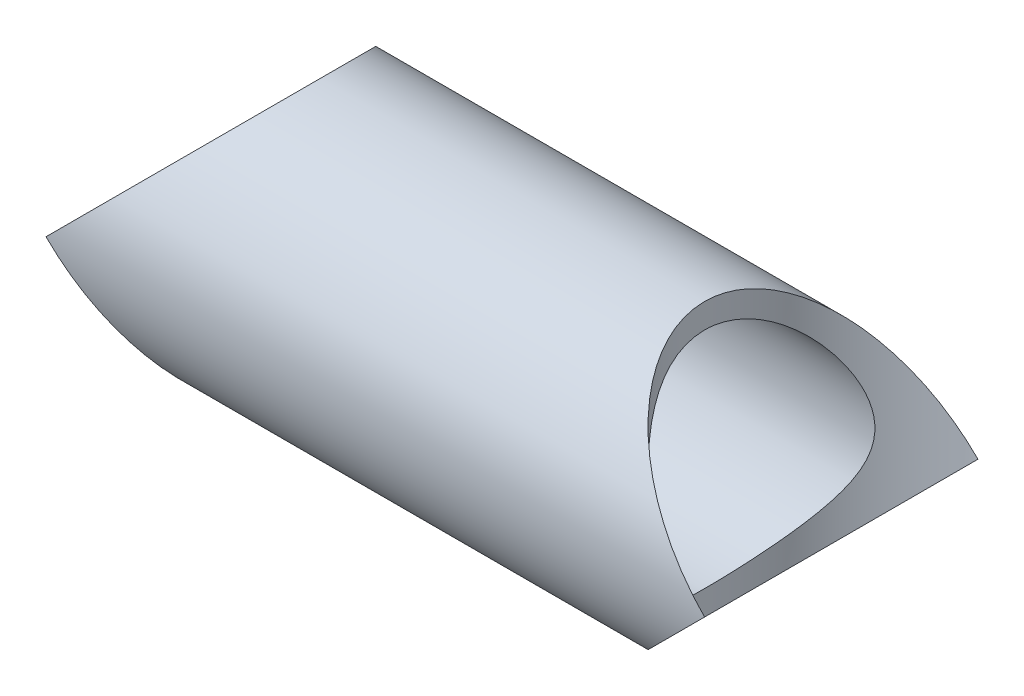
ISO-10303-21;
HEADER;
FILE_DESCRIPTION(('STEP AP214'),'2;1');
FILE_NAME('part.step','',(''),(''),'','','');
FILE_SCHEMA(('AUTOMOTIVE_DESIGN { 1 0 10303 214 1 1 1 1 }'));
ENDSEC;
DATA;
#1=APPLICATION_CONTEXT('core data for automotive mechanical design processes');
#2=APPLICATION_PROTOCOL_DEFINITION('international standard','automotive_design',2000,#1);
#3=PRODUCT_CONTEXT('',#1,'mechanical');
#4=PRODUCT('Part','Part','',(#3));
#5=PRODUCT_RELATED_PRODUCT_CATEGORY('part','',(#4));
#6=PRODUCT_DEFINITION_FORMATION('','',#4);
#7=PRODUCT_DEFINITION_CONTEXT('part definition',#1,'design');
#8=PRODUCT_DEFINITION('design','',#6,#7);
#9=PRODUCT_DEFINITION_SHAPE('','',#8);
#10=(LENGTH_UNIT() NAMED_UNIT(*) SI_UNIT(.MILLI.,.METRE.));
#11=(NAMED_UNIT(*) PLANE_ANGLE_UNIT() SI_UNIT($,.RADIAN.));
#12=(NAMED_UNIT(*) SI_UNIT($,.STERADIAN.) SOLID_ANGLE_UNIT());
#13=UNCERTAINTY_MEASURE_WITH_UNIT(LENGTH_MEASURE(1.E-05),#10,'distance_accuracy_value','');
#14=(GEOMETRIC_REPRESENTATION_CONTEXT(3) GLOBAL_UNCERTAINTY_ASSIGNED_CONTEXT((#13)) GLOBAL_UNIT_ASSIGNED_CONTEXT((#10,
#11,#12)) REPRESENTATION_CONTEXT('',''));
#15=CARTESIAN_POINT('',(0.,0.,0.));
#16=DIRECTION('',(0.,0.,1.));
#17=DIRECTION('',(1.,0.,0.));
#18=AXIS2_PLACEMENT_3D('',#15,#16,#17);
#19=CARTESIAN_POINT('',(0.,0.,0.));
#20=DIRECTION('',(1.,0.,0.));
#21=DIRECTION('',(0.,0.,-1.));
#22=AXIS2_PLACEMENT_3D('',#19,#20,#21);
#23=CYLINDRICAL_SURFACE('',#22,17.272);
#24=CARTESIAN_POINT('',(-21.082,17.272,0.));
#25=CARTESIAN_POINT('',(-21.0819974571892,17.271997400769,0.411969546046924));
#26=CARTESIAN_POINT('',(-21.0698979581089,17.2572347382735,0.82398266570214));
#27=CARTESIAN_POINT('',(-21.0217712674214,17.1984419810361,1.64467646555702));
#28=CARTESIAN_POINT('',(-20.9857322284046,17.1543973949897,2.05335539428116));
#29=CARTESIAN_POINT('',(-20.8904711960164,17.0377282079174,2.86462013572414));
#30=CARTESIAN_POINT('',(-20.8312073055811,16.9650519548038,3.26719356329438));
#31=CARTESIAN_POINT('',(-20.6908226929877,16.7923770824112,4.06246678309607));
#32=CARTESIAN_POINT('',(-20.6097042051748,16.6923812561846,4.45516758018942));
#33=CARTESIAN_POINT('',(-20.4278769814588,16.4673550193317,5.22573282350051));
#34=CARTESIAN_POINT('',(-20.3272985338859,16.3424909517279,5.6036768900091));
#35=CARTESIAN_POINT('',(-20.1081013138992,16.0690286184839,6.34543751861682));
#36=CARTESIAN_POINT('',(-19.9894824728678,15.9204302625689,6.70925402697433));
#37=CARTESIAN_POINT('',(-19.7362399951363,15.6012775827915,7.42120493645665));
#38=CARTESIAN_POINT('',(-19.6016199309319,15.4307281591085,7.76934281420934));
#39=CARTESIAN_POINT('',(-19.3183957146022,15.0693154120948,8.4490195623764));
#40=CARTESIAN_POINT('',(-19.1697886381679,14.8784478396864,8.78055493935614));
#41=CARTESIAN_POINT('',(-18.8050246129541,14.4059100339488,9.54246297905149));
#42=CARTESIAN_POINT('',(-18.583796883026,14.1162727394238,9.96549372592007));
#43=CARTESIAN_POINT('',(-18.1243638254064,13.5057131163688,10.778513444702));
#44=CARTESIAN_POINT('',(-17.8861528723319,13.1847804087374,11.1684913739729));
#45=CARTESIAN_POINT('',(-17.397190804996,12.5134565283622,11.9158876755438));
#46=CARTESIAN_POINT('',(-17.1464084909186,12.1629904272153,12.2732181268326));
#47=CARTESIAN_POINT('',(-16.6380816184922,11.4352470478156,12.9539720469538));
#48=CARTESIAN_POINT('',(-16.3805378870474,11.0579730385598,13.2773996380877));
#49=CARTESIAN_POINT('',(-15.8597451820756,10.2709022503498,13.8955112849849));
#50=CARTESIAN_POINT('',(-15.5964739788716,9.86065951423709,14.1896089758705));
#51=CARTESIAN_POINT('',(-15.0751602485807,9.01350765030095,14.7422722270848));
#52=CARTESIAN_POINT('',(-14.8171194827016,8.5765897326821,15.0008259830028));
#53=CARTESIAN_POINT('',(-14.3149717526541,7.67652626118942,15.4807119999985));
#54=CARTESIAN_POINT('',(-14.070833876304,7.21344385084406,15.7021291515829));
#55=CARTESIAN_POINT('',(-13.7226228026443,6.49805660466487,16.0051278072619));
#56=CARTESIAN_POINT('',(-13.609585318976,6.2562149887016,16.1012465180021));
#57=CARTESIAN_POINT('',(-13.3910671702633,5.76544358591262,16.2834359902852));
#58=CARTESIAN_POINT('',(-13.2855879175507,5.51651248642654,16.3695048757984));
#59=CARTESIAN_POINT('',(-12.9524393884434,4.68200907547958,16.6365084203585));
#60=CARTESIAN_POINT('',(-12.7446096245939,4.08036836698642,16.7949505173963));
#61=CARTESIAN_POINT('',(-12.4895307485763,3.15396408208561,16.984512209331));
#62=CARTESIAN_POINT('',(-12.4140142927317,2.84162103788167,17.0396393227736));
#63=CARTESIAN_POINT('',(-12.2848487749683,2.21000018322315,17.1329967954062));
#64=CARTESIAN_POINT('',(-12.2311868728216,1.89072656118795,17.17123707725));
#65=CARTESIAN_POINT('',(-12.156393183993,1.30972387108432,17.224241369686));
#66=CARTESIAN_POINT('',(-12.130974529567,1.04882275454375,17.2421173525233));
#67=CARTESIAN_POINT('',(-12.0969594703745,0.525288392474299,17.2659992303282));
#68=CARTESIAN_POINT('',(-12.0883682437612,0.262654638714181,17.2720014715016));
#69=CARTESIAN_POINT('',(-12.0883767032652,-0.313709266542585,17.2719982424689));
#70=CARTESIAN_POINT('',(-12.1006425521989,-0.627448326348049,17.263431937013));
#71=CARTESIAN_POINT('',(-12.1490638187679,-1.25225888022392,17.2293881403538));
#72=CARTESIAN_POINT('',(-12.1852310167793,-1.56332898220732,17.2039023099121));
#73=CARTESIAN_POINT('',(-12.2797345720248,-2.18094423110293,17.1365746034446));
#74=CARTESIAN_POINT('',(-12.3381191885186,-2.48747800792352,17.0946971168044));
#75=CARTESIAN_POINT('',(-12.4744560593086,-3.09364467723231,16.9954628363119));
#76=CARTESIAN_POINT('',(-12.552415488627,-3.39327499523887,16.9381003659578));
#77=CARTESIAN_POINT('',(-12.756963505347,-4.09409497947193,16.78488590863));
#78=CARTESIAN_POINT('',(-12.8908657317345,-4.49175633476133,16.6826485760223));
#79=CARTESIAN_POINT('',(-13.1825232390176,-5.27075628352036,16.4531520564412));
#80=CARTESIAN_POINT('',(-13.3402898260654,-5.65208702961766,16.3258810006799));
#81=CARTESIAN_POINT('',(-13.6735973789277,-6.39926736461119,16.0477625128062));
#82=CARTESIAN_POINT('',(-13.8491844052273,-6.76507318203271,15.896853407417));
#83=CARTESIAN_POINT('',(-14.2123694461541,-7.48048207309385,15.573006641214));
#84=CARTESIAN_POINT('',(-14.3999670650766,-7.83008567988304,15.4000697059503));
#85=CARTESIAN_POINT('',(-14.8607453832388,-8.65287033366831,14.9582100637985));
#86=CARTESIAN_POINT('',(-15.1376666432576,-9.1183965914384,14.6788789201623));
#87=CARTESIAN_POINT('',(-15.6967792901481,-10.0192128678948,14.0794214498589));
#88=CARTESIAN_POINT('',(-15.9789727300897,-10.4544907823033,13.7592789355778));
#89=CARTESIAN_POINT('',(-16.5403675992567,-11.2939007838856,13.0790406954938));
#90=CARTESIAN_POINT('',(-16.8195715322211,-11.6980610333705,12.7189818327195));
#91=CARTESIAN_POINT('',(-17.3682011107248,-12.4740062829321,11.9589252456115));
#92=CARTESIAN_POINT('',(-17.6376302361273,-12.8458028718657,11.5589419285744));
#93=CARTESIAN_POINT('',(-18.1063729386441,-13.481393910569,10.8057503562355));
#94=CARTESIAN_POINT('',(-18.3087012447039,-13.7516641240993,10.4598673674054));
#95=CARTESIAN_POINT('',(-18.6998339721646,-14.2682701887558,9.7433803197121));
#96=CARTESIAN_POINT('',(-18.8886389572698,-14.51460703767,9.37277729252075));
#97=CARTESIAN_POINT('',(-19.2491642892864,-14.9807667784142,8.608069734366));
#98=CARTESIAN_POINT('',(-19.420906268794,-15.2006233192589,8.21399600092984));
#99=CARTESIAN_POINT('',(-19.7442089787664,-15.6115705713909,7.403194645415));
#100=CARTESIAN_POINT('',(-19.8957732353394,-15.8026663094652,6.98647099943797));
#101=CARTESIAN_POINT('',(-20.1518934390218,-16.1238269123025,6.20416858228577));
#102=CARTESIAN_POINT('',(-20.2600687905135,-16.2587512811017,5.84176455996164));
#103=CARTESIAN_POINT('',(-20.4583196746215,-16.5051343125671,5.10427293441255));
#104=CARTESIAN_POINT('',(-20.5483985457555,-16.6165973036723,4.7291876856201));
#105=CARTESIAN_POINT('',(-20.7087698302159,-16.8145107009343,3.96845301096871));
#106=CARTESIAN_POINT('',(-20.7790691326883,-16.9009698161357,3.58280731475349));
#107=CARTESIAN_POINT('',(-20.8985100685957,-17.047603763313,2.803293837013));
#108=CARTESIAN_POINT('',(-20.9476514546421,-17.107778287957,2.40942595940647));
#109=CARTESIAN_POINT('',(-21.0238707932101,-17.2010211639035,1.61477812574959));
#110=CARTESIAN_POINT('',(-21.0508613298558,-17.23398212293,1.21397709739105));
#111=CARTESIAN_POINT('',(-21.0818466847301,-17.2718162976593,0.410156935764197));
#112=CARTESIAN_POINT('',(-21.0858414563436,-17.2766894564248,0.007137798001182));
#113=CARTESIAN_POINT('',(-21.070744373257,-17.2582605045352,-0.797812951281574));
#114=CARTESIAN_POINT('',(-21.0516527199516,-17.2349586396653,-1.19974457225762));
#115=CARTESIAN_POINT('',(-20.9908155184505,-17.1605959506735,-1.9992803453275));
#116=CARTESIAN_POINT('',(-20.9490706344321,-17.1095359404015,-2.39688462394745));
#117=CARTESIAN_POINT('',(-20.8471039715095,-16.9845289087982,-3.16038819356661));
#118=CARTESIAN_POINT('',(-20.788183768376,-16.9121916486331,-3.52672810743099));
#119=CARTESIAN_POINT('',(-20.6523002604325,-16.7448842276505,-4.25075088374505));
#120=CARTESIAN_POINT('',(-20.5753378628998,-16.6499152048993,-4.60843418050755));
#121=CARTESIAN_POINT('',(-20.4046709947555,-16.4385445049941,-5.31334842362213));
#122=CARTESIAN_POINT('',(-20.3109640610799,-16.3221396746293,-5.66057782344964));
#123=CARTESIAN_POINT('',(-20.1082888931914,-16.0692333956989,-6.3430419065265));
#124=CARTESIAN_POINT('',(-19.9993197568016,-15.9327307590907,-6.67827587923236));
#125=CARTESIAN_POINT('',(-19.7572004272866,-15.6277825875954,-7.36533449589875));
#126=CARTESIAN_POINT('',(-19.6227543044437,-15.4575641647838,-7.71591466311745));
#127=CARTESIAN_POINT('',(-19.3396613475592,-15.0965660542174,-8.40032132931948));
#128=CARTESIAN_POINT('',(-19.1910138123467,-14.9057853511748,-8.73414699983507));
#129=CARTESIAN_POINT('',(-18.8815704327287,-14.5052110810432,-9.38438563691978));
#130=CARTESIAN_POINT('',(-18.7207718189411,-14.2954131775104,-9.70079460543201));
#131=CARTESIAN_POINT('',(-18.3891035721379,-13.8582347484962,-10.3156997046853));
#132=CARTESIAN_POINT('',(-18.2182325432335,-13.6308517846152,-10.6141933410016));
#133=CARTESIAN_POINT('',(-17.8321831921334,-13.1108498196742,-11.253027025234));
#134=CARTESIAN_POINT('',(-17.6151648356834,-12.8144809461208,-11.5892084783425));
#135=CARTESIAN_POINT('',(-17.1729930697113,-12.199534534346,-12.2348752513826));
#136=CARTESIAN_POINT('',(-16.9478384079211,-11.8809535703631,-12.5443564368014));
#137=CARTESIAN_POINT('',(-16.4927845777299,-11.2222995746593,-13.1369135966404));
#138=CARTESIAN_POINT('',(-16.2628792781642,-10.8821974279403,-13.419952459635));
#139=CARTESIAN_POINT('',(-15.8026211285518,-10.1815476406534,-13.9589916340699));
#140=CARTESIAN_POINT('',(-15.5722683193586,-9.82100178884007,-14.2149943054912));
#141=CARTESIAN_POINT('',(-15.123758602887,-9.09278195474178,-14.69100801056));
#142=CARTESIAN_POINT('',(-14.9054599564513,-8.72582251655781,-14.9119779732586));
#143=CARTESIAN_POINT('',(-14.4773598953233,-7.97253495969737,-15.3279425560283));
#144=CARTESIAN_POINT('',(-14.267560123112,-7.58620312911811,-15.5229321716832));
#145=CARTESIAN_POINT('',(-13.8626972856056,-6.79421487476482,-15.8855302918148));
#146=CARTESIAN_POINT('',(-13.6676134469088,-6.38858706154877,-16.0531777971998));
#147=CARTESIAN_POINT('',(-13.2992832335173,-5.55706305413474,-16.3596187429614));
#148=CARTESIAN_POINT('',(-13.1260239004826,-5.13117909599183,-16.4984293373992));
#149=CARTESIAN_POINT('',(-12.8636425653572,-4.40646692615594,-16.7031461616668));
#150=CARTESIAN_POINT('',(-12.7658552461594,-4.11324727012552,-16.7778489375232));
#151=CARTESIAN_POINT('',(-12.5868377007514,-3.51853362909134,-16.9125629974884));
#152=CARTESIAN_POINT('',(-12.505601318789,-3.21704276789043,-16.9725797454138));
#153=CARTESIAN_POINT('',(-12.3629082512253,-2.60771553752355,-17.0767980414873));
#154=CARTESIAN_POINT('',(-12.3013900696421,-2.29990214654181,-17.1210488087989));
#155=CARTESIAN_POINT('',(-12.2005595337995,-1.67886331656174,-17.1930497741383));
#156=CARTESIAN_POINT('',(-12.1612323765099,-1.36564162937251,-17.2208109725626));
#157=CARTESIAN_POINT('',(-12.1188507595994,-0.876421606841301,-17.2506372142612));
#158=CARTESIAN_POINT('',(-12.1074420378846,-0.701460759815005,-17.258640158557));
#159=CARTESIAN_POINT('',(-12.0921995314463,-0.351008758830892,-17.2693230584493));
#160=CARTESIAN_POINT('',(-12.0883673989749,-0.175517497558625,-17.2720018529914));
#161=CARTESIAN_POINT('',(-12.0883804959222,0.31359094415609,-17.2719966893254));
#162=CARTESIAN_POINT('',(-12.1006367190732,0.627265639032524,-17.2634362925274));
#163=CARTESIAN_POINT('',(-12.1490323432566,1.25196021777853,-17.2294100138348));
#164=CARTESIAN_POINT('',(-12.1851865302922,1.56297833723809,-17.2039336657613));
#165=CARTESIAN_POINT('',(-12.2796745592885,2.18061203576001,-17.1366176950819));
#166=CARTESIAN_POINT('',(-12.3380646893532,2.48721437545696,-17.0947365375606));
#167=CARTESIAN_POINT('',(-12.4744221316752,3.09351516874403,-16.9954877769663));
#168=CARTESIAN_POINT('',(-12.5523967354644,3.39321100548893,-16.9381144053596));
#169=CARTESIAN_POINT('',(-12.7569707152106,4.09411932259536,-16.7848805183704));
#170=CARTESIAN_POINT('',(-12.8908819843072,4.49180450770336,-16.6826361695849));
#171=CARTESIAN_POINT('',(-13.1825615296672,5.27085378216075,-16.4531215446588));
#172=CARTESIAN_POINT('',(-13.3403413522981,5.65220985715067,-16.3258391474107));
#173=CARTESIAN_POINT('',(-13.6736545786644,6.39938824801199,-16.0477136399411));
#174=CARTESIAN_POINT('',(-13.8492317002579,6.76516901681072,-15.8968119909677));
#175=CARTESIAN_POINT('',(-14.2123945649903,7.4805288819737,-15.5729834863457));
#176=CARTESIAN_POINT('',(-14.3999798777904,7.83010855816495,-15.4000574197689));
#177=CARTESIAN_POINT('',(-14.8607463611332,8.65287208071617,-14.9582091253977));
#178=CARTESIAN_POINT('',(-15.1376686622351,9.1183999871466,-14.6788768831002));
#179=CARTESIAN_POINT('',(-15.6967837461029,10.0192199045568,-14.079416544555));
#180=CARTESIAN_POINT('',(-15.9789785884586,10.4544997727315,-13.7592722091734));
#181=CARTESIAN_POINT('',(-16.5403739014852,11.2939099766889,-13.0790326872297));
#182=CARTESIAN_POINT('',(-16.8195768980295,11.6980687230707,-12.7189746886696));
#183=CARTESIAN_POINT('',(-17.3682040259572,12.4740103055436,-11.9589209174398));
#184=CARTESIAN_POINT('',(-17.6376316588131,12.8458048024235,-11.5589396414989));
#185=CARTESIAN_POINT('',(-18.1063360474469,13.4813438868333,-10.805809635093));
#186=CARTESIAN_POINT('',(-18.308629280392,13.7515679891519,-10.4599903907992));
#187=CARTESIAN_POINT('',(-18.6996987486227,14.2680926708497,-9.74363682070327));
#188=CARTESIAN_POINT('',(-18.8884754433157,14.5143940634283,-9.37310333572945));
#189=CARTESIAN_POINT('',(-19.2490159140505,14.9805764753207,-8.60840519684817));
#190=CARTESIAN_POINT('',(-19.4207952748929,15.2004817373424,-8.21426273248718));
#191=CARTESIAN_POINT('',(-19.7441607311672,15.6115097425485,-7.40332725735581));
#192=CARTESIAN_POINT('',(-19.8957509614126,15.8026383803485,-6.98653890924693));
#193=CARTESIAN_POINT('',(-20.1519985385404,16.1239587003351,-6.20384766628443));
#194=CARTESIAN_POINT('',(-20.2602643107035,16.2589951467311,-5.8411098784785));
#195=CARTESIAN_POINT('',(-20.4586613505477,16.5055580625487,-5.10292909357133));
#196=CARTESIAN_POINT('',(-20.5487960268041,16.6170889511122,-4.72748850008096));
#197=CARTESIAN_POINT('',(-20.7091144155218,16.814934829699,-3.96663149507253));
#198=CARTESIAN_POINT('',(-20.7793360724173,16.9012977862519,-3.58123560417746));
#199=CARTESIAN_POINT('',(-20.8986214280214,17.0477402178382,-2.80239617372333));
#200=CARTESIAN_POINT('',(-20.9476946031647,17.1078314651512,-2.40895632154163));
#201=CARTESIAN_POINT('',(-21.017621492965,17.1933757576352,-1.67994872753491));
#202=CARTESIAN_POINT('',(-21.0417268073089,17.2228236650014,-1.34515437269219));
#203=CARTESIAN_POINT('',(-21.0739186727483,17.2621387708272,-0.673583304077913));
#204=CARTESIAN_POINT('',(-21.0820020788781,17.2720021250045,-0.336806214121713));
#205=CARTESIAN_POINT('',(-21.082,17.272,0.));
#206=B_SPLINE_CURVE_WITH_KNOTS('',3,(#24,#25,#26,#27,#28,#29,#30,#31,#32,#33,#34,#35,#36,#37,
#38,#39,#40,#41,#42,#43,#44,#45,#46,#47,#48,#49,#50,#51,#52,#53,#54,#55,#56,#57,#58,#59,#60,#61,
#62,#63,#64,#65,#66,#67,#68,#69,#70,#71,#72,#73,#74,#75,#76,#77,#78,#79,#80,#81,#82,#83,#84,#85,
#86,#87,#88,#89,#90,#91,#92,#93,#94,#95,#96,#97,#98,#99,#100,#101,#102,#103,#104,#105,#106,#107,
#108,#109,#110,#111,#112,#113,#114,#115,#116,#117,#118,#119,#120,#121,#122,#123,#124,#125,#126,
#127,#128,#129,#130,#131,#132,#133,#134,#135,#136,#137,#138,#139,#140,#141,#142,#143,#144,#145,
#146,#147,#148,#149,#150,#151,#152,#153,#154,#155,#156,#157,#158,#159,#160,#161,#162,#163,#164,
#165,#166,#167,#168,#169,#170,#171,#172,#173,#174,#175,#176,#177,#178,#179,#180,#181,#182,#183,
#184,#185,#186,#187,#188,#189,#190,#191,#192,#193,#194,#195,#196,#197,#198,#199,#200,#201,#202,
#203,#204,#205),.UNSPECIFIED.,.T.,.F.,(4,2,2,2,2,2,2,2,2,2,2,2,2,2,2,2,2,2,2,2,2,2,2,2,2,2,2,2,
2,2,2,2,2,2,2,2,2,2,2,2,2,2,2,2,2,2,2,2,2,2,2,2,2,2,2,2,2,2,2,2,2,2,2,2,2,2,2,2,2,2,2,2,2,2,2,2,
2,2,2,2,2,2,2,2,2,2,2,2,2,2,4),(0.,1.23554676616955,2.47170544657441,3.71010446902627,
4.94837692947894,6.17862914428073,7.40888603853748,8.63886877494632,9.86910924141908,
11.5418520924663,13.2151516065574,14.8928321675335,16.570308499516,18.2764813479693,
19.9832194675136,21.6860013527844,22.5368432287014,23.3878436806424,25.3475276462313,
26.32466765681,27.3012327362401,28.0887068093797,28.8764231667854,29.8172552873796,
30.7585514667427,31.7019040497021,32.6456029185651,33.9391436001567,35.2332990495787,
36.5308890765223,37.8284363746369,39.6544021432982,41.4810944383279,43.3061136062544,
45.1304765553047,46.5792181016825,48.0278992237231,49.4747196112623,50.9212868304592,
52.1247415930247,53.3279741327004,54.5307870709653,55.7336140727182,56.9411653769513,
58.1487191290354,59.3562623470865,60.5637701627025,61.696640205531,62.8294532925946,
63.9624331499557,65.0954800081223,66.3310748655699,67.5667307600039,68.8026691301398,
70.0387791877011,71.531226927085,73.02390535743,74.5186482210479,76.0132605009747,
77.4544897664833,78.8959962459988,80.3354282225541,81.7740014642868,82.72724439694,
83.6801321423021,84.6300184887734,85.5792704404687,86.1055951516458,86.6320346275517,
87.5726055369292,88.5137589360323,89.4573107819701,90.4012144455443,91.6948335495898,
92.9890804524397,94.2865873920649,95.5840478588077,97.4100202889709,99.2367215547784,
101.061734944833,102.886088040009,104.33457204886,105.783006802472,107.230100939238,
108.676898248169,109.881440142089,111.085755374749,112.287760112434,113.489225681725,
114.499150255145,115.509273048631),.UNSPECIFIED.);
#207=CARTESIAN_POINT('',(-21.082,17.272,0.));
#208=VERTEX_POINT('',#207);
#209=EDGE_CURVE('E51',#208,#208,#206,.T.);
#210=ORIENTED_EDGE('',*,*,#209,.T.);
#211=EDGE_LOOP('',(#210));
#212=FACE_BOUND('',#211,.T.);
#213=CARTESIAN_POINT('',(-89.5116279011606,0.,17.272));
#214=CARTESIAN_POINT('',(-89.5116195040778,0.313590944156095,17.2719966893254));
#215=CARTESIAN_POINT('',(-89.4993632809268,0.627265639032532,17.2634362925274));
#216=CARTESIAN_POINT('',(-89.4509676567434,1.25196021777854,17.2294100138348));
#217=CARTESIAN_POINT('',(-89.4148134697078,1.5629783372381,17.2039336657613));
#218=CARTESIAN_POINT('',(-89.3203254407115,2.18061203576001,17.1366176950819));
#219=CARTESIAN_POINT('',(-89.2619353106468,2.48721437545696,17.0947365375606));
#220=CARTESIAN_POINT('',(-89.1255778683248,3.09351516874404,16.9954877769664));
#221=CARTESIAN_POINT('',(-89.0476032645356,3.39321100548893,16.9381144053596));
#222=CARTESIAN_POINT('',(-88.8430292847894,4.09411932259537,16.7848805183704));
#223=CARTESIAN_POINT('',(-88.7091180156928,4.49180450770336,16.6826361695849));
#224=CARTESIAN_POINT('',(-88.4174384703327,5.27085378216075,16.4531215446588));
#225=CARTESIAN_POINT('',(-88.2596586477019,5.65220985715067,16.3258391474107));
#226=CARTESIAN_POINT('',(-87.9263454213356,6.39938824801198,16.0477136399411));
#227=CARTESIAN_POINT('',(-87.7507682997421,6.76516901681072,15.8968119909677));
#228=CARTESIAN_POINT('',(-87.3876054350097,7.4805288819737,15.5729834863457));
#229=CARTESIAN_POINT('',(-87.2000201222097,7.83010855816495,15.4000574197689));
#230=CARTESIAN_POINT('',(-86.7392536388668,8.65287208071618,14.9582091253976));
#231=CARTESIAN_POINT('',(-86.4623313377649,9.11839998714661,14.6788768831002));
#232=CARTESIAN_POINT('',(-85.9032162538971,10.0192199045568,14.079416544555));
#233=CARTESIAN_POINT('',(-85.6210214115413,10.4544997727315,13.7592722091734));
#234=CARTESIAN_POINT('',(-85.0596260985148,11.2939099766889,13.0790326872297));
#235=CARTESIAN_POINT('',(-84.7804231019705,11.6980687230707,12.7189746886696));
#236=CARTESIAN_POINT('',(-84.2317959740428,12.4740103055436,11.9589209174398));
#237=CARTESIAN_POINT('',(-83.9623683411869,12.8458048024235,11.5589396414989));
#238=CARTESIAN_POINT('',(-83.4936639525531,13.4813438868334,10.805809635093));
#239=CARTESIAN_POINT('',(-83.291370719608,13.7515679891519,10.4599903907992));
#240=CARTESIAN_POINT('',(-82.9003012513773,14.2680926708497,9.74363682070325));
#241=CARTESIAN_POINT('',(-82.7115245566843,14.5143940634283,9.37310333572943));
#242=CARTESIAN_POINT('',(-82.3509840859495,14.9805764753207,8.60840519684816));
#243=CARTESIAN_POINT('',(-82.1792047251071,15.2004817373424,8.21426273248717));
#244=CARTESIAN_POINT('',(-81.8558392688328,15.6115097425485,7.4033272573558));
#245=CARTESIAN_POINT('',(-81.7042490385873,15.8026383803485,6.98653890924692));
#246=CARTESIAN_POINT('',(-81.4480014614596,16.1239587003351,6.20384766628441));
#247=CARTESIAN_POINT('',(-81.3397356892965,16.2589951467311,5.84110987847849));
#248=CARTESIAN_POINT('',(-81.1413386494523,16.5055580625487,5.10292909357132));
#249=CARTESIAN_POINT('',(-81.0512039731958,16.6170889511122,4.72748850008095));
#250=CARTESIAN_POINT('',(-80.8908855844782,16.814934829699,3.96663149507252));
#251=CARTESIAN_POINT('',(-80.8206639275827,16.9012977862519,3.58123560417745));
#252=CARTESIAN_POINT('',(-80.7013785719786,17.0477402178382,2.80239617372332));
#253=CARTESIAN_POINT('',(-80.6523053968353,17.1078314651512,2.40895632154162));
#254=CARTESIAN_POINT('',(-80.582378507035,17.1933757576352,1.6799487275349));
#255=CARTESIAN_POINT('',(-80.5582731926911,17.2228236650014,1.34515437269218));
#256=CARTESIAN_POINT('',(-80.5260813272517,17.2621387708272,0.673583304077907));
#257=CARTESIAN_POINT('',(-80.5179979211219,17.2720021250045,0.336806214121709));
#258=CARTESIAN_POINT('',(-80.5180025428107,17.271997400769,-0.411969546046926));
#259=CARTESIAN_POINT('',(-80.5301020418912,17.2572347382735,-0.823982665702141));
#260=CARTESIAN_POINT('',(-80.5782287325786,17.1984419810361,-1.64467646555702));
#261=CARTESIAN_POINT('',(-80.6142677715954,17.1543973949897,-2.05335539428116));
#262=CARTESIAN_POINT('',(-80.7095288039835,17.0377282079174,-2.86462013572414));
#263=CARTESIAN_POINT('',(-80.7687926944189,16.9650519548038,-3.26719356329438));
#264=CARTESIAN_POINT('',(-80.9091773070123,16.7923770824112,-4.06246678309607));
#265=CARTESIAN_POINT('',(-80.9902957948252,16.6923812561846,-4.45516758018942));
#266=CARTESIAN_POINT('',(-81.1721230185412,16.4673550193317,-5.22573282350051));
#267=CARTESIAN_POINT('',(-81.2727014661141,16.3424909517279,-5.60367689000911));
#268=CARTESIAN_POINT('',(-81.4918986861008,16.0690286184839,-6.34543751861682));
#269=CARTESIAN_POINT('',(-81.6105175271322,15.9204302625689,-6.70925402697433));
#270=CARTESIAN_POINT('',(-81.8637600048637,15.6012775827915,-7.42120493645665));
#271=CARTESIAN_POINT('',(-81.9983800690681,15.4307281591085,-7.76934281420934));
#272=CARTESIAN_POINT('',(-82.2816042853978,15.0693154120948,-8.4490195623764));
#273=CARTESIAN_POINT('',(-82.4302113618321,14.8784478396864,-8.78055493935614));
#274=CARTESIAN_POINT('',(-82.7949753870459,14.4059100339488,-9.54246297905149));
#275=CARTESIAN_POINT('',(-83.016203116974,14.1162727394239,-9.96549372592007));
#276=CARTESIAN_POINT('',(-83.4756361745936,13.5057131163688,-10.778513444702));
#277=CARTESIAN_POINT('',(-83.7138471276681,13.1847804087374,-11.1684913739729));
#278=CARTESIAN_POINT('',(-84.202809195004,12.5134565283622,-11.9158876755438));
#279=CARTESIAN_POINT('',(-84.4535915090814,12.1629904272153,-12.2732181268326));
#280=CARTESIAN_POINT('',(-84.9619183815078,11.4352470478156,-12.9539720469538));
#281=CARTESIAN_POINT('',(-85.2194621129526,11.0579730385598,-13.2773996380877));
#282=CARTESIAN_POINT('',(-85.7402548179244,10.2709022503498,-13.8955112849849));
#283=CARTESIAN_POINT('',(-86.0035260211284,9.86065951423709,-14.1896089758705));
#284=CARTESIAN_POINT('',(-86.5248397514193,9.01350765030096,-14.7422722270848));
#285=CARTESIAN_POINT('',(-86.7828805172984,8.5765897326821,-15.0008259830028));
#286=CARTESIAN_POINT('',(-87.2850282473459,7.67652626118942,-15.4807119999985));
#287=CARTESIAN_POINT('',(-87.529166123696,7.21344385084406,-15.7021291515829));
#288=CARTESIAN_POINT('',(-87.8773771973557,6.49805660466487,-16.0051278072619));
#289=CARTESIAN_POINT('',(-87.990414681024,6.25621498870161,-16.1012465180021));
#290=CARTESIAN_POINT('',(-88.2089328297367,5.76544358591262,-16.2834359902852));
#291=CARTESIAN_POINT('',(-88.3144120824493,5.51651248642654,-16.3695048757984));
#292=CARTESIAN_POINT('',(-88.6475606115566,4.68200907547958,-16.6365084203585));
#293=CARTESIAN_POINT('',(-88.8553903754061,4.08036836698642,-16.7949505173963));
#294=CARTESIAN_POINT('',(-89.1104692514236,3.15396408208561,-16.984512209331));
#295=CARTESIAN_POINT('',(-89.1859857072683,2.84162103788168,-17.0396393227736));
#296=CARTESIAN_POINT('',(-89.3151512250317,2.21000018322315,-17.1329967954062));
#297=CARTESIAN_POINT('',(-89.3688131271784,1.89072656118796,-17.17123707725));
#298=CARTESIAN_POINT('',(-89.443606816007,1.30972387108433,-17.224241369686));
#299=CARTESIAN_POINT('',(-89.469025470433,1.04882275454375,-17.2421173525233));
#300=CARTESIAN_POINT('',(-89.5030405296255,0.525288392474297,-17.2659992303282));
#301=CARTESIAN_POINT('',(-89.5116317562388,0.262654638714178,-17.2720014715016));
#302=CARTESIAN_POINT('',(-89.5116232967348,-0.31370926654259,-17.2719982424689));
#303=CARTESIAN_POINT('',(-89.4993574478011,-0.627448326348053,-17.263431937013));
#304=CARTESIAN_POINT('',(-89.4509361812321,-1.25225888022392,-17.2293881403538));
#305=CARTESIAN_POINT('',(-89.4147689832207,-1.56332898220733,-17.2039023099121));
#306=CARTESIAN_POINT('',(-89.3202654279752,-2.18094423110294,-17.1365746034446));
#307=CARTESIAN_POINT('',(-89.2618808114814,-2.48747800792353,-17.0946971168044));
#308=CARTESIAN_POINT('',(-89.1255439406914,-3.09364467723232,-16.9954628363119));
#309=CARTESIAN_POINT('',(-89.047584511373,-3.39327499523888,-16.9381003659578));
#310=CARTESIAN_POINT('',(-88.843036494653,-4.09409497947193,-16.78488590863));
#311=CARTESIAN_POINT('',(-88.7091342682655,-4.49175633476133,-16.6826485760223));
#312=CARTESIAN_POINT('',(-88.4174767609824,-5.27075628352036,-16.4531520564412));
#313=CARTESIAN_POINT('',(-88.2597101739346,-5.65208702961766,-16.3258810006799));
#314=CARTESIAN_POINT('',(-87.9264026210723,-6.39926736461119,-16.0477625128062));
#315=CARTESIAN_POINT('',(-87.7508155947727,-6.76507318203271,-15.896853407417));
#316=CARTESIAN_POINT('',(-87.3876305538459,-7.48048207309385,-15.573006641214));
#317=CARTESIAN_POINT('',(-87.2000329349234,-7.83008567988304,-15.4000697059503));
#318=CARTESIAN_POINT('',(-86.7392546167612,-8.65287033366832,-14.9582100637985));
#319=CARTESIAN_POINT('',(-86.4623333567424,-9.11839659143842,-14.6788789201623));
#320=CARTESIAN_POINT('',(-85.9032207098519,-10.0192128678948,-14.0794214498588));
#321=CARTESIAN_POINT('',(-85.6210272699103,-10.4544907823033,-13.7592789355778));
#322=CARTESIAN_POINT('',(-85.0596324007433,-11.2939007838856,-13.0790406954938));
#323=CARTESIAN_POINT('',(-84.7804284677788,-11.6980610333706,-12.7189818327195));
#324=CARTESIAN_POINT('',(-84.2317988892752,-12.4740062829321,-11.9589252456115));
#325=CARTESIAN_POINT('',(-83.9623697638727,-12.8458028718657,-11.5589419285744));
#326=CARTESIAN_POINT('',(-83.4936270613558,-13.481393910569,-10.8057503562355));
#327=CARTESIAN_POINT('',(-83.2912987552961,-13.7516641240993,-10.4598673674054));
#328=CARTESIAN_POINT('',(-82.9001660278354,-14.2682701887558,-9.74338031971208));
#329=CARTESIAN_POINT('',(-82.7113610427302,-14.51460703767,-9.37277729252073));
#330=CARTESIAN_POINT('',(-82.3508357107136,-14.9807667784142,-8.60806973436599));
#331=CARTESIAN_POINT('',(-82.179093731206,-15.2006233192589,-8.21399600092982));
#332=CARTESIAN_POINT('',(-81.8557910212336,-15.6115705713909,-7.40319464541499));
#333=CARTESIAN_POINT('',(-81.7042267646606,-15.8026663094652,-6.98647099943796));
#334=CARTESIAN_POINT('',(-81.4481065609782,-16.1238269123025,-6.20416858228576));
#335=CARTESIAN_POINT('',(-81.3399312094865,-16.2587512811017,-5.84176455996163));
#336=CARTESIAN_POINT('',(-81.1416803253785,-16.5051343125671,-5.10427293441254));
#337=CARTESIAN_POINT('',(-81.0516014542445,-16.6165973036723,-4.72918768562009));
#338=CARTESIAN_POINT('',(-80.8912301697841,-16.8145107009343,-3.9684530109687));
#339=CARTESIAN_POINT('',(-80.8209308673117,-16.9009698161357,-3.58280731475348));
#340=CARTESIAN_POINT('',(-80.7014899314043,-17.047603763313,-2.80329383701299));
#341=CARTESIAN_POINT('',(-80.6523485453579,-17.107778287957,-2.40942595940646));
#342=CARTESIAN_POINT('',(-80.5761292067899,-17.2010211639035,-1.61477812574958));
#343=CARTESIAN_POINT('',(-80.5491386701442,-17.23398212293,-1.21397709739103));
#344=CARTESIAN_POINT('',(-80.5181533152698,-17.2718162976593,-0.41015693576418));
#345=CARTESIAN_POINT('',(-80.5141585436564,-17.2766894564247,-0.0071377980011626));
#346=CARTESIAN_POINT('',(-80.529255626743,-17.2582605045352,0.797812951281594));
#347=CARTESIAN_POINT('',(-80.5483472800484,-17.2349586396653,1.19974457225764));
#348=CARTESIAN_POINT('',(-80.6091844815495,-17.1605959506735,1.99928034532751));
#349=CARTESIAN_POINT('',(-80.6509293655679,-17.1095359404015,2.39688462394746));
#350=CARTESIAN_POINT('',(-80.7528960284905,-16.9845289087981,3.16038819356663));
#351=CARTESIAN_POINT('',(-80.811816231624,-16.9121916486331,3.526728107431));
#352=CARTESIAN_POINT('',(-80.9476997395675,-16.7448842276505,4.25075088374506));
#353=CARTESIAN_POINT('',(-81.0246621371002,-16.6499152048993,4.60843418050757));
#354=CARTESIAN_POINT('',(-81.1953290052445,-16.4385445049941,5.31334842362214));
#355=CARTESIAN_POINT('',(-81.2890359389201,-16.3221396746293,5.66057782344965));
#356=CARTESIAN_POINT('',(-81.4917111068086,-16.0692333956989,6.34304190652651));
#357=CARTESIAN_POINT('',(-81.6006802431984,-15.9327307590907,6.67827587923237));
#358=CARTESIAN_POINT('',(-81.8427995727134,-15.6277825875954,7.36533449589876));
#359=CARTESIAN_POINT('',(-81.9772456955563,-15.4575641647838,7.71591466311747));
#360=CARTESIAN_POINT('',(-82.2603386524408,-15.0965660542174,8.4003213293195));
#361=CARTESIAN_POINT('',(-82.4089861876533,-14.9057853511748,8.73414699983508));
#362=CARTESIAN_POINT('',(-82.7184295672713,-14.5052110810432,9.3843856369198));
#363=CARTESIAN_POINT('',(-82.8792281810589,-14.2954131775104,9.70079460543202));
#364=CARTESIAN_POINT('',(-83.2108964278621,-13.8582347484961,10.3156997046853));
#365=CARTESIAN_POINT('',(-83.3817674567666,-13.6308517846152,10.6141933410017));
#366=CARTESIAN_POINT('',(-83.7678168078667,-13.1108498196742,11.253027025234));
#367=CARTESIAN_POINT('',(-83.9848351643166,-12.8144809461207,11.5892084783425));
#368=CARTESIAN_POINT('',(-84.4270069302887,-12.199534534346,12.2348752513826));
#369=CARTESIAN_POINT('',(-84.6521615920789,-11.8809535703631,12.5443564368014));
#370=CARTESIAN_POINT('',(-85.1072154222701,-11.2222995746593,13.1369135966404));
#371=CARTESIAN_POINT('',(-85.3371207218358,-10.8821974279403,13.419952459635));
#372=CARTESIAN_POINT('',(-85.7973788714482,-10.1815476406534,13.9589916340699));
#373=CARTESIAN_POINT('',(-86.0277316806414,-9.82100178884006,14.2149943054912));
#374=CARTESIAN_POINT('',(-86.476241397113,-9.09278195474176,14.69100801056));
#375=CARTESIAN_POINT('',(-86.6945400435487,-8.72582251655779,14.9119779732586));
#376=CARTESIAN_POINT('',(-87.1226401046767,-7.97253495969735,15.3279425560283));
#377=CARTESIAN_POINT('',(-87.332439876888,-7.5862031291181,15.5229321716832));
#378=CARTESIAN_POINT('',(-87.7373027143944,-6.79421487476481,15.8855302918148));
#379=CARTESIAN_POINT('',(-87.9323865530912,-6.38858706154876,16.0531777971998));
#380=CARTESIAN_POINT('',(-88.3007167664828,-5.55706305413473,16.3596187429614));
#381=CARTESIAN_POINT('',(-88.4739760995174,-5.13117909599182,16.4984293373992));
#382=CARTESIAN_POINT('',(-88.7363574346428,-4.40646692615593,16.7031461616668));
#383=CARTESIAN_POINT('',(-88.8341447538406,-4.11324727012551,16.7778489375232));
#384=CARTESIAN_POINT('',(-89.0131622992486,-3.51853362909133,16.9125629974884));
#385=CARTESIAN_POINT('',(-89.094398681211,-3.21704276789041,16.9725797454138));
#386=CARTESIAN_POINT('',(-89.2370917487747,-2.60771553752353,17.0767980414873));
#387=CARTESIAN_POINT('',(-89.2986099303579,-2.2999021465418,17.1210488087989));
#388=CARTESIAN_POINT('',(-89.3994404662005,-1.67886331656173,17.1930497741383));
#389=CARTESIAN_POINT('',(-89.4387676234901,-1.3656416293725,17.2208109725626));
#390=CARTESIAN_POINT('',(-89.4811492404006,-0.876421606841288,17.2506372142612));
#391=CARTESIAN_POINT('',(-89.4925579621154,-0.701460759814991,17.258640158557));
#392=CARTESIAN_POINT('',(-89.5078004685537,-0.351008758830881,17.2693230584493));
#393=CARTESIAN_POINT('',(-89.5116326010251,-0.175517497558618,17.2720018529914));
#394=CARTESIAN_POINT('',(-89.5116279011606,0.,17.272));
#395=B_SPLINE_CURVE_WITH_KNOTS('',3,(#213,#214,#215,#216,#217,#218,#219,#220,#221,#222,#223,
#224,#225,#226,#227,#228,#229,#230,#231,#232,#233,#234,#235,#236,#237,#238,#239,#240,#241,#242,
#243,#244,#245,#246,#247,#248,#249,#250,#251,#252,#253,#254,#255,#256,#257,#258,#259,#260,#261,
#262,#263,#264,#265,#266,#267,#268,#269,#270,#271,#272,#273,#274,#275,#276,#277,#278,#279,#280,
#281,#282,#283,#284,#285,#286,#287,#288,#289,#290,#291,#292,#293,#294,#295,#296,#297,#298,#299,
#300,#301,#302,#303,#304,#305,#306,#307,#308,#309,#310,#311,#312,#313,#314,#315,#316,#317,#318,
#319,#320,#321,#322,#323,#324,#325,#326,#327,#328,#329,#330,#331,#332,#333,#334,#335,#336,#337,
#338,#339,#340,#341,#342,#343,#344,#345,#346,#347,#348,#349,#350,#351,#352,#353,#354,#355,#356,
#357,#358,#359,#360,#361,#362,#363,#364,#365,#366,#367,#368,#369,#370,#371,#372,#373,#374,#375,
#376,#377,#378,#379,#380,#381,#382,#383,#384,#385,#386,#387,#388,#389,#390,#391,#392,#393,#394),
.UNSPECIFIED.,.T.,.F.,(4,2,2,2,2,2,2,2,2,2,2,2,2,2,2,2,2,2,2,2,2,2,2,2,2,2,2,2,2,2,2,2,2,2,2,2,
2,2,2,2,2,2,2,2,2,2,2,2,2,2,2,2,2,2,2,2,2,2,2,2,2,2,2,2,2,2,2,2,2,2,2,2,2,2,2,2,2,2,2,2,2,2,2,2,
2,2,2,2,2,2,4),(0.,0.94057090937746,1.88172430848058,2.82527615441841,3.76917981799258,
5.06279892203805,6.35704582488801,7.6545527645132,8.95201323125596,10.7779856614192,
12.6046869272267,14.4297003172816,16.2540534124576,17.7025374213082,19.1509721749207,
20.5980663116862,22.0448636206173,23.2494055145371,24.4537207471974,25.6557254848821,
26.857191054173,27.8671156275937,28.8772384210792,30.1127851872488,31.3489438676537,
32.5873428901055,33.8256153505582,35.05586756536,36.2861244596167,37.5161071960256,
38.7463476624983,40.4190905135455,42.0923900276367,43.7700705886127,45.4475469205952,
47.1537197690485,48.8604578885929,50.5632397738636,51.4140816497807,52.2650821017216,
54.2247660673105,55.2019060778893,56.1784711573193,56.9659452304589,57.7536615878647,
58.6944937084588,59.635789887822,60.5791424707814,61.5228413396444,62.816382021236,
64.110537470658,65.4081274976016,66.7056747957161,68.5316405643775,70.3583328594072,
72.1833520273337,74.007714976384,75.4564565227618,76.9051376448023,78.3519580323415,
79.7985252515385,81.0019800141039,82.2052125537796,83.4080254920445,84.6108524937974,
85.8184037980306,87.0259575501146,88.2335007681658,89.4410085837817,90.5738786266103,
91.7066917136739,92.839671571035,93.9727184292016,95.2083132866492,96.4439691810832,
97.6799075512191,98.9160176087804,100.408465348164,101.901143778509,103.395886642127,
104.890498922054,106.331728187563,107.773234667078,109.212666643633,110.651239885366,
111.604482818019,112.557370563381,113.507256909853,114.456508861548,114.982833572725,
115.509273048631),.UNSPECIFIED.);
#396=CARTESIAN_POINT('',(-89.5116279011606,0.,17.272));
#397=VERTEX_POINT('',#396);
#398=EDGE_CURVE('E21',#397,#397,#395,.T.);
#399=ORIENTED_EDGE('',*,*,#398,.T.);
#400=EDGE_LOOP('',(#399));
#401=FACE_BOUND('',#400,.T.);
#402=ADVANCED_FACE('F17',(#212,#401),#23,.F.);
#403=CARTESIAN_POINT('',(-101.6,-38.1,0.));
#404=DIRECTION('',(0.,1.,0.));
#405=DIRECTION('',(0.,0.,1.));
#406=AXIS2_PLACEMENT_3D('',#403,#404,#405);
#407=CYLINDRICAL_SURFACE('',#406,21.082);
#408=ORIENTED_EDGE('',*,*,#398,.F.);
#409=EDGE_LOOP('',(#408));
#410=FACE_BOUND('',#409,.T.);
#411=CARTESIAN_POINT('',(-101.6,0.,0.));
#412=DIRECTION('',(0.707106781186547,0.707106781186547,0.));
#413=DIRECTION('',(-0.707106781186547,0.707106781186547,0.));
#414=AXIS2_PLACEMENT_3D('',#411,#412,#413);
#415=ELLIPSE('',#414,29.8144503219496,21.082);
#416=CARTESIAN_POINT('',(-101.6,0.,21.082));
#417=VERTEX_POINT('',#416);
#418=CARTESIAN_POINT('',(-101.6,0.,-21.082));
#419=VERTEX_POINT('',#418);
#420=EDGE_CURVE('E45',#417,#419,#415,.T.);
#421=ORIENTED_EDGE('',*,*,#420,.F.);
#422=CARTESIAN_POINT('',(-101.6,0.,0.));
#423=DIRECTION('',(-0.707106781186547,0.707106781186547,0.));
#424=DIRECTION('',(0.707106781186547,0.707106781186547,0.));
#425=AXIS2_PLACEMENT_3D('',#422,#423,#424);
#426=ELLIPSE('',#425,29.8144503219496,21.082);
#427=EDGE_CURVE('E29',#419,#417,#426,.F.);
#428=ORIENTED_EDGE('',*,*,#427,.F.);
#429=EDGE_LOOP('',(#421,#428));
#430=FACE_BOUND('',#429,.T.);
#431=ADVANCED_FACE('F48',(#410,#430),#407,.F.);
#432=CARTESIAN_POINT('',(0.,-38.1,0.));
#433=DIRECTION('',(0.,1.,0.));
#434=DIRECTION('',(0.,0.,1.));
#435=AXIS2_PLACEMENT_3D('',#432,#433,#434);
#436=CYLINDRICAL_SURFACE('',#435,21.082);
#437=ORIENTED_EDGE('',*,*,#209,.F.);
#438=EDGE_LOOP('',(#437));
#439=FACE_BOUND('',#438,.T.);
#440=CARTESIAN_POINT('',(0.,0.,0.));
#441=DIRECTION('',(0.707106781186547,0.707106781186547,0.));
#442=DIRECTION('',(0.707106781186547,-0.707106781186547,0.));
#443=AXIS2_PLACEMENT_3D('',#440,#441,#442);
#444=ELLIPSE('',#443,29.8144503219496,21.082);
#445=CARTESIAN_POINT('',(0.,0.,21.082));
#446=VERTEX_POINT('',#445);
#447=CARTESIAN_POINT('',(0.,0.,-21.082));
#448=VERTEX_POINT('',#447);
#449=EDGE_CURVE('E11',#446,#448,#444,.F.);
#450=ORIENTED_EDGE('',*,*,#449,.F.);
#451=CARTESIAN_POINT('',(0.,0.,0.));
#452=DIRECTION('',(0.707106781186547,-0.707106781186547,0.));
#453=DIRECTION('',(0.707106781186547,0.707106781186547,0.));
#454=AXIS2_PLACEMENT_3D('',#451,#452,#453);
#455=ELLIPSE('',#454,29.8144503219496,21.082);
#456=EDGE_CURVE('E49',#448,#446,#455,.F.);
#457=ORIENTED_EDGE('',*,*,#456,.F.);
#458=EDGE_LOOP('',(#450,#457));
#459=FACE_BOUND('',#458,.T.);
#460=ADVANCED_FACE('F57',(#439,#459),#436,.F.);
#461=CARTESIAN_POINT('',(0.,0.,0.));
#462=DIRECTION('',(1.,0.,0.));
#463=DIRECTION('',(0.,0.,-1.));
#464=AXIS2_PLACEMENT_3D('',#461,#462,#463);
#465=CYLINDRICAL_SURFACE('',#464,21.082);
#466=ORIENTED_EDGE('',*,*,#456,.T.);
#467=ORIENTED_EDGE('',*,*,#449,.T.);
#468=EDGE_LOOP('',(#466,#467));
#469=FACE_BOUND('',#468,.T.);
#470=ORIENTED_EDGE('',*,*,#427,.T.);
#471=ORIENTED_EDGE('',*,*,#420,.T.);
#472=EDGE_LOOP('',(#470,#471));
#473=FACE_BOUND('',#472,.T.);
#474=ADVANCED_FACE('F44',(#469,#473),#465,.T.);
#475=CLOSED_SHELL('',(#402,#431,#460,#474));
#476=MANIFOLD_SOLID_BREP('B1',#475);
#477=ADVANCED_BREP_SHAPE_REPRESENTATION('',(#18,#476),#14);
#478=SHAPE_DEFINITION_REPRESENTATION(#9,#477);
ENDSEC;
END-ISO-10303-21;
